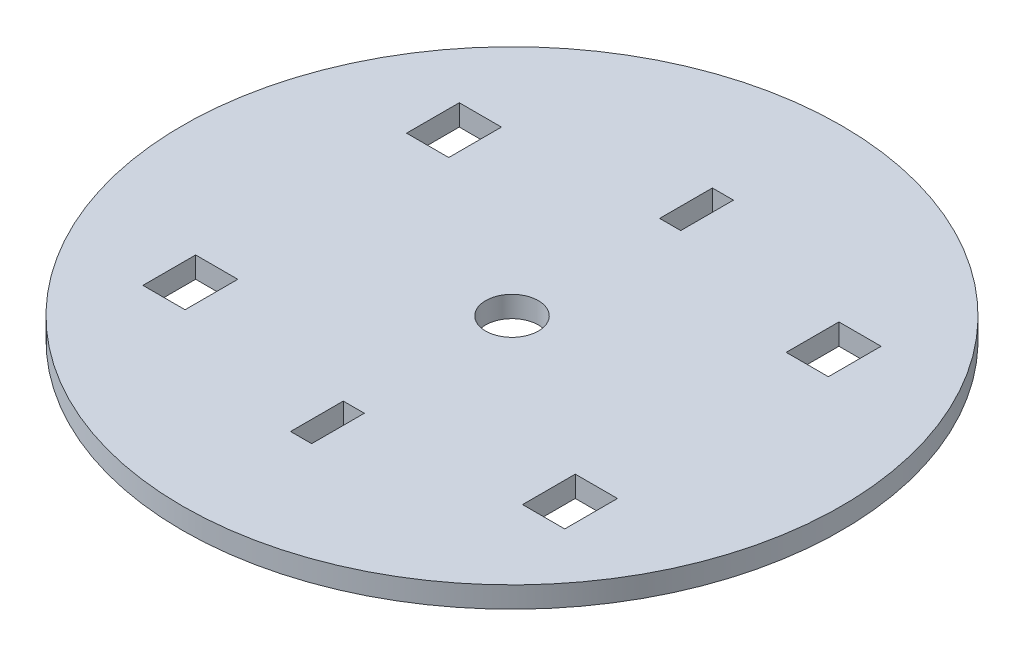
ISO-10303-21;
HEADER;
FILE_DESCRIPTION(('STEP AP214'),'2;1');
FILE_NAME('part.step','',(''),(''),'','','');
FILE_SCHEMA(('AUTOMOTIVE_DESIGN { 1 0 10303 214 1 1 1 1 }'));
ENDSEC;
DATA;
#1=APPLICATION_CONTEXT('core data for automotive mechanical design processes');
#2=APPLICATION_PROTOCOL_DEFINITION('international standard','automotive_design',2000,#1);
#3=PRODUCT_CONTEXT('',#1,'mechanical');
#4=PRODUCT('Part','Part','',(#3));
#5=PRODUCT_RELATED_PRODUCT_CATEGORY('part','',(#4));
#6=PRODUCT_DEFINITION_FORMATION('','',#4);
#7=PRODUCT_DEFINITION_CONTEXT('part definition',#1,'design');
#8=PRODUCT_DEFINITION('design','',#6,#7);
#9=PRODUCT_DEFINITION_SHAPE('','',#8);
#10=(LENGTH_UNIT() NAMED_UNIT(*) SI_UNIT(.MILLI.,.METRE.));
#11=(NAMED_UNIT(*) PLANE_ANGLE_UNIT() SI_UNIT($,.RADIAN.));
#12=(NAMED_UNIT(*) SI_UNIT($,.STERADIAN.) SOLID_ANGLE_UNIT());
#13=UNCERTAINTY_MEASURE_WITH_UNIT(LENGTH_MEASURE(1.E-05),#10,'distance_accuracy_value','');
#14=(GEOMETRIC_REPRESENTATION_CONTEXT(3) GLOBAL_UNCERTAINTY_ASSIGNED_CONTEXT((#13)) GLOBAL_UNIT_ASSIGNED_CONTEXT((#10,
#11,#12)) REPRESENTATION_CONTEXT('',''));
#15=CARTESIAN_POINT('',(0.,0.,0.));
#16=DIRECTION('',(0.,0.,1.));
#17=DIRECTION('',(1.,0.,0.));
#18=AXIS2_PLACEMENT_3D('',#15,#16,#17);
#19=CARTESIAN_POINT('',(0.,8.,0.));
#20=DIRECTION('',(0.,1.,0.));
#21=DIRECTION('',(0.,0.,1.));
#22=AXIS2_PLACEMENT_3D('',#19,#20,#21);
#23=PLANE('',#22);
#24=DIRECTION('',(0.,0.,-1.));
#25=VECTOR('',#24,1.);
#26=CARTESIAN_POINT('',(4.,8.,-60.));
#27=LINE('',#26,#25);
#28=CARTESIAN_POINT('',(4.,8.,-60.));
#29=VERTEX_POINT('',#28);
#30=CARTESIAN_POINT('',(4.,8.,-80.));
#31=VERTEX_POINT('',#30);
#32=EDGE_CURVE('E228',#29,#31,#27,.T.);
#33=ORIENTED_EDGE('',*,*,#32,.F.);
#34=DIRECTION('',(1.,0.,0.));
#35=VECTOR('',#34,1.);
#36=CARTESIAN_POINT('',(-4.,8.,-60.));
#37=LINE('',#36,#35);
#38=CARTESIAN_POINT('',(-4.,8.,-60.));
#39=VERTEX_POINT('',#38);
#40=EDGE_CURVE('E236',#39,#29,#37,.T.);
#41=ORIENTED_EDGE('',*,*,#40,.F.);
#42=DIRECTION('',(0.,0.,1.));
#43=VECTOR('',#42,1.);
#44=CARTESIAN_POINT('',(-4.,8.,-60.));
#45=LINE('',#44,#43);
#46=CARTESIAN_POINT('',(-4.,8.,-80.));
#47=VERTEX_POINT('',#46);
#48=EDGE_CURVE('E250',#47,#39,#45,.T.);
#49=ORIENTED_EDGE('',*,*,#48,.F.);
#50=DIRECTION('',(-1.,0.,0.));
#51=VECTOR('',#50,1.);
#52=CARTESIAN_POINT('',(-4.,8.,-80.));
#53=LINE('',#52,#51);
#54=EDGE_CURVE('E247',#31,#47,#53,.T.);
#55=ORIENTED_EDGE('',*,*,#54,.F.);
#56=EDGE_LOOP('',(#33,#41,#49,#55));
#57=FACE_BOUND('',#56,.T.);
#58=DIRECTION('',(0.,0.,1.));
#59=VECTOR('',#58,1.);
#60=CARTESIAN_POINT('',(-80.,8.,40.));
#61=LINE('',#60,#59);
#62=CARTESIAN_POINT('',(-80.,8.,40.));
#63=VERTEX_POINT('',#62);
#64=CARTESIAN_POINT('',(-80.,8.,60.));
#65=VERTEX_POINT('',#64);
#66=EDGE_CURVE('E264',#63,#65,#61,.T.);
#67=ORIENTED_EDGE('',*,*,#66,.F.);
#68=DIRECTION('',(-1.,0.,0.));
#69=VECTOR('',#68,1.);
#70=CARTESIAN_POINT('',(-80.,8.,40.));
#71=LINE('',#70,#69);
#72=CARTESIAN_POINT('',(-64.,8.,40.));
#73=VERTEX_POINT('',#72);
#74=EDGE_CURVE('E273',#73,#63,#71,.T.);
#75=ORIENTED_EDGE('',*,*,#74,.F.);
#76=DIRECTION('',(0.,0.,-1.));
#77=VECTOR('',#76,1.);
#78=CARTESIAN_POINT('',(-64.,8.,40.));
#79=LINE('',#78,#77);
#80=CARTESIAN_POINT('',(-64.,8.,60.));
#81=VERTEX_POINT('',#80);
#82=EDGE_CURVE('E270',#81,#73,#79,.T.);
#83=ORIENTED_EDGE('',*,*,#82,.F.);
#84=DIRECTION('',(1.,0.,0.));
#85=VECTOR('',#84,1.);
#86=CARTESIAN_POINT('',(-80.,8.,60.));
#87=LINE('',#86,#85);
#88=EDGE_CURVE('E266',#65,#81,#87,.T.);
#89=ORIENTED_EDGE('',*,*,#88,.F.);
#90=EDGE_LOOP('',(#67,#75,#83,#89));
#91=FACE_BOUND('',#90,.T.);
#92=DIRECTION('',(0.,0.,1.));
#93=VECTOR('',#92,1.);
#94=CARTESIAN_POINT('',(64.,8.,-60.));
#95=LINE('',#94,#93);
#96=CARTESIAN_POINT('',(64.,8.,-60.));
#97=VERTEX_POINT('',#96);
#98=CARTESIAN_POINT('',(64.,8.,-40.));
#99=VERTEX_POINT('',#98);
#100=EDGE_CURVE('E286',#97,#99,#95,.T.);
#101=ORIENTED_EDGE('',*,*,#100,.F.);
#102=DIRECTION('',(-1.,0.,0.));
#103=VECTOR('',#102,1.);
#104=CARTESIAN_POINT('',(64.,8.,-60.));
#105=LINE('',#104,#103);
#106=CARTESIAN_POINT('',(80.,8.,-60.));
#107=VERTEX_POINT('',#106);
#108=EDGE_CURVE('E295',#107,#97,#105,.T.);
#109=ORIENTED_EDGE('',*,*,#108,.F.);
#110=DIRECTION('',(0.,0.,-1.));
#111=VECTOR('',#110,1.);
#112=CARTESIAN_POINT('',(80.,8.,-60.));
#113=LINE('',#112,#111);
#114=CARTESIAN_POINT('',(80.,8.,-40.));
#115=VERTEX_POINT('',#114);
#116=EDGE_CURVE('E292',#115,#107,#113,.T.);
#117=ORIENTED_EDGE('',*,*,#116,.F.);
#118=DIRECTION('',(1.,0.,0.));
#119=VECTOR('',#118,1.);
#120=CARTESIAN_POINT('',(64.,8.,-40.));
#121=LINE('',#120,#119);
#122=EDGE_CURVE('E288',#99,#115,#121,.T.);
#123=ORIENTED_EDGE('',*,*,#122,.F.);
#124=EDGE_LOOP('',(#101,#109,#117,#123));
#125=FACE_BOUND('',#124,.T.);
#126=DIRECTION('',(0.,0.,1.));
#127=VECTOR('',#126,1.);
#128=CARTESIAN_POINT('',(64.,8.,40.));
#129=LINE('',#128,#127);
#130=CARTESIAN_POINT('',(64.,8.,40.));
#131=VERTEX_POINT('',#130);
#132=CARTESIAN_POINT('',(64.,8.,60.));
#133=VERTEX_POINT('',#132);
#134=EDGE_CURVE('E257',#131,#133,#129,.T.);
#135=ORIENTED_EDGE('',*,*,#134,.F.);
#136=DIRECTION('',(-1.,0.,0.));
#137=VECTOR('',#136,1.);
#138=CARTESIAN_POINT('',(64.,8.,40.));
#139=LINE('',#138,#137);
#140=CARTESIAN_POINT('',(80.,8.,40.));
#141=VERTEX_POINT('',#140);
#142=EDGE_CURVE('E313',#141,#131,#139,.T.);
#143=ORIENTED_EDGE('',*,*,#142,.F.);
#144=DIRECTION('',(0.,0.,-1.));
#145=VECTOR('',#144,1.);
#146=CARTESIAN_POINT('',(80.,8.,40.));
#147=LINE('',#146,#145);
#148=CARTESIAN_POINT('',(80.,8.,60.));
#149=VERTEX_POINT('',#148);
#150=EDGE_CURVE('E310',#149,#141,#147,.T.);
#151=ORIENTED_EDGE('',*,*,#150,.F.);
#152=DIRECTION('',(1.,0.,0.));
#153=VECTOR('',#152,1.);
#154=CARTESIAN_POINT('',(64.,8.,60.));
#155=LINE('',#154,#153);
#156=EDGE_CURVE('E307',#133,#149,#155,.T.);
#157=ORIENTED_EDGE('',*,*,#156,.F.);
#158=EDGE_LOOP('',(#135,#143,#151,#157));
#159=FACE_BOUND('',#158,.T.);
#160=DIRECTION('',(0.,0.,1.));
#161=VECTOR('',#160,1.);
#162=CARTESIAN_POINT('',(-80.,8.,-60.));
#163=LINE('',#162,#161);
#164=CARTESIAN_POINT('',(-80.,8.,-60.));
#165=VERTEX_POINT('',#164);
#166=CARTESIAN_POINT('',(-80.,8.,-40.));
#167=VERTEX_POINT('',#166);
#168=EDGE_CURVE('E279',#165,#167,#163,.T.);
#169=ORIENTED_EDGE('',*,*,#168,.F.);
#170=DIRECTION('',(-1.,0.,0.));
#171=VECTOR('',#170,1.);
#172=CARTESIAN_POINT('',(-80.,8.,-60.));
#173=LINE('',#172,#171);
#174=CARTESIAN_POINT('',(-64.,8.,-60.));
#175=VERTEX_POINT('',#174);
#176=EDGE_CURVE('E331',#175,#165,#173,.T.);
#177=ORIENTED_EDGE('',*,*,#176,.F.);
#178=DIRECTION('',(0.,0.,-1.));
#179=VECTOR('',#178,1.);
#180=CARTESIAN_POINT('',(-64.,8.,-60.));
#181=LINE('',#180,#179);
#182=CARTESIAN_POINT('',(-64.,8.,-40.));
#183=VERTEX_POINT('',#182);
#184=EDGE_CURVE('E328',#183,#175,#181,.T.);
#185=ORIENTED_EDGE('',*,*,#184,.F.);
#186=DIRECTION('',(1.,0.,0.));
#187=VECTOR('',#186,1.);
#188=CARTESIAN_POINT('',(-80.,8.,-40.));
#189=LINE('',#188,#187);
#190=EDGE_CURVE('E325',#167,#183,#189,.T.);
#191=ORIENTED_EDGE('',*,*,#190,.F.);
#192=EDGE_LOOP('',(#169,#177,#185,#191));
#193=FACE_BOUND('',#192,.T.);
#194=CARTESIAN_POINT('',(0.,8.,0.));
#195=DIRECTION('',(0.,1.,0.));
#196=DIRECTION('',(0.,0.,1.));
#197=AXIS2_PLACEMENT_3D('',#194,#195,#196);
#198=CIRCLE('',#197,125.);
#199=CARTESIAN_POINT('',(0.,8.,125.));
#200=VERTEX_POINT('',#199);
#201=EDGE_CURVE('E350',#200,#200,#198,.T.);
#202=ORIENTED_EDGE('',*,*,#201,.T.);
#203=EDGE_LOOP('',(#202));
#204=FACE_BOUND('',#203,.T.);
#205=CARTESIAN_POINT('',(0.,8.,0.));
#206=DIRECTION('',(0.,1.,0.));
#207=DIRECTION('',(0.,0.,1.));
#208=AXIS2_PLACEMENT_3D('',#205,#206,#207);
#209=CIRCLE('',#208,10.);
#210=CARTESIAN_POINT('',(0.,8.,10.));
#211=VERTEX_POINT('',#210);
#212=EDGE_CURVE('E344',#211,#211,#209,.T.);
#213=ORIENTED_EDGE('',*,*,#212,.F.);
#214=EDGE_LOOP('',(#213));
#215=FACE_BOUND('',#214,.T.);
#216=DIRECTION('',(1.,0.,0.));
#217=VECTOR('',#216,1.);
#218=CARTESIAN_POINT('',(-4.,8.,60.));
#219=LINE('',#218,#217);
#220=CARTESIAN_POINT('',(-4.,8.,60.));
#221=VERTEX_POINT('',#220);
#222=CARTESIAN_POINT('',(4.,8.,60.));
#223=VERTEX_POINT('',#222);
#224=EDGE_CURVE('E222',#221,#223,#219,.T.);
#225=ORIENTED_EDGE('',*,*,#224,.T.);
#226=DIRECTION('',(0.,0.,1.));
#227=VECTOR('',#226,1.);
#228=CARTESIAN_POINT('',(4.,8.,60.));
#229=LINE('',#228,#227);
#230=CARTESIAN_POINT('',(4.,8.,80.));
#231=VERTEX_POINT('',#230);
#232=EDGE_CURVE('E51',#223,#231,#229,.T.);
#233=ORIENTED_EDGE('',*,*,#232,.T.);
#234=DIRECTION('',(-1.,0.,0.));
#235=VECTOR('',#234,1.);
#236=CARTESIAN_POINT('',(-4.,8.,80.));
#237=LINE('',#236,#235);
#238=CARTESIAN_POINT('',(-4.,8.,80.));
#239=VERTEX_POINT('',#238);
#240=EDGE_CURVE('E213',#231,#239,#237,.T.);
#241=ORIENTED_EDGE('',*,*,#240,.T.);
#242=DIRECTION('',(0.,0.,-1.));
#243=VECTOR('',#242,1.);
#244=CARTESIAN_POINT('',(-4.,8.,60.));
#245=LINE('',#244,#243);
#246=EDGE_CURVE('E216',#239,#221,#245,.T.);
#247=ORIENTED_EDGE('',*,*,#246,.T.);
#248=EDGE_LOOP('',(#225,#233,#241,#247));
#249=FACE_BOUND('',#248,.T.);
#250=ADVANCED_FACE('F36',(#57,#91,#125,#159,#193,#204,#215,#249),#23,.T.);
#251=CARTESIAN_POINT('',(0.,0.,0.));
#252=DIRECTION('',(0.,1.,0.));
#253=DIRECTION('',(0.,0.,1.));
#254=AXIS2_PLACEMENT_3D('',#251,#252,#253);
#255=PLANE('',#254);
#256=CARTESIAN_POINT('',(0.,0.,0.));
#257=DIRECTION('',(0.,1.,0.));
#258=DIRECTION('',(0.,0.,1.));
#259=AXIS2_PLACEMENT_3D('',#256,#257,#258);
#260=CIRCLE('',#259,10.);
#261=CARTESIAN_POINT('',(0.,0.,10.));
#262=VERTEX_POINT('',#261);
#263=EDGE_CURVE('E337',#262,#262,#260,.T.);
#264=ORIENTED_EDGE('',*,*,#263,.T.);
#265=EDGE_LOOP('',(#264));
#266=FACE_BOUND('',#265,.T.);
#267=CARTESIAN_POINT('',(0.,0.,0.));
#268=DIRECTION('',(0.,1.,0.));
#269=DIRECTION('',(0.,0.,1.));
#270=AXIS2_PLACEMENT_3D('',#267,#268,#269);
#271=CIRCLE('',#270,125.);
#272=CARTESIAN_POINT('',(0.,0.,125.));
#273=VERTEX_POINT('',#272);
#274=EDGE_CURVE('E347',#273,#273,#271,.T.);
#275=ORIENTED_EDGE('',*,*,#274,.F.);
#276=EDGE_LOOP('',(#275));
#277=FACE_BOUND('',#276,.T.);
#278=DIRECTION('',(-1.,0.,0.));
#279=VECTOR('',#278,1.);
#280=CARTESIAN_POINT('',(0.,0.,-60.));
#281=LINE('',#280,#279);
#282=CARTESIAN_POINT('',(-64.,0.,-60.));
#283=VERTEX_POINT('',#282);
#284=CARTESIAN_POINT('',(-80.,0.,-60.));
#285=VERTEX_POINT('',#284);
#286=EDGE_CURVE('E361',#283,#285,#281,.T.);
#287=ORIENTED_EDGE('',*,*,#286,.T.);
#288=DIRECTION('',(0.,0.,1.));
#289=VECTOR('',#288,1.);
#290=CARTESIAN_POINT('',(-80.,0.,0.));
#291=LINE('',#290,#289);
#292=CARTESIAN_POINT('',(-80.,0.,-40.));
#293=VERTEX_POINT('',#292);
#294=EDGE_CURVE('E364',#285,#293,#291,.T.);
#295=ORIENTED_EDGE('',*,*,#294,.T.);
#296=DIRECTION('',(1.,0.,0.));
#297=VECTOR('',#296,1.);
#298=CARTESIAN_POINT('',(0.,0.,-40.));
#299=LINE('',#298,#297);
#300=CARTESIAN_POINT('',(-64.,0.,-40.));
#301=VERTEX_POINT('',#300);
#302=EDGE_CURVE('E353',#293,#301,#299,.T.);
#303=ORIENTED_EDGE('',*,*,#302,.T.);
#304=DIRECTION('',(0.,0.,-1.));
#305=VECTOR('',#304,1.);
#306=CARTESIAN_POINT('',(-64.,0.,0.));
#307=LINE('',#306,#305);
#308=EDGE_CURVE('E358',#301,#283,#307,.T.);
#309=ORIENTED_EDGE('',*,*,#308,.T.);
#310=EDGE_LOOP('',(#287,#295,#303,#309));
#311=FACE_BOUND('',#310,.T.);
#312=DIRECTION('',(-1.,0.,0.));
#313=VECTOR('',#312,1.);
#314=CARTESIAN_POINT('',(0.,0.,40.));
#315=LINE('',#314,#313);
#316=CARTESIAN_POINT('',(80.,0.,40.));
#317=VERTEX_POINT('',#316);
#318=CARTESIAN_POINT('',(64.,0.,40.));
#319=VERTEX_POINT('',#318);
#320=EDGE_CURVE('E373',#317,#319,#315,.T.);
#321=ORIENTED_EDGE('',*,*,#320,.T.);
#322=DIRECTION('',(0.,0.,1.));
#323=VECTOR('',#322,1.);
#324=CARTESIAN_POINT('',(64.,0.,0.));
#325=LINE('',#324,#323);
#326=CARTESIAN_POINT('',(64.,0.,60.));
#327=VERTEX_POINT('',#326);
#328=EDGE_CURVE('E376',#319,#327,#325,.T.);
#329=ORIENTED_EDGE('',*,*,#328,.T.);
#330=DIRECTION('',(1.,0.,0.));
#331=VECTOR('',#330,1.);
#332=CARTESIAN_POINT('',(0.,0.,60.));
#333=LINE('',#332,#331);
#334=CARTESIAN_POINT('',(80.,0.,60.));
#335=VERTEX_POINT('',#334);
#336=EDGE_CURVE('E367',#327,#335,#333,.T.);
#337=ORIENTED_EDGE('',*,*,#336,.T.);
#338=DIRECTION('',(0.,0.,-1.));
#339=VECTOR('',#338,1.);
#340=CARTESIAN_POINT('',(80.,0.,0.));
#341=LINE('',#340,#339);
#342=EDGE_CURVE('E370',#335,#317,#341,.T.);
#343=ORIENTED_EDGE('',*,*,#342,.T.);
#344=EDGE_LOOP('',(#321,#329,#337,#343));
#345=FACE_BOUND('',#344,.T.);
#346=DIRECTION('',(-1.,0.,0.));
#347=VECTOR('',#346,1.);
#348=CARTESIAN_POINT('',(0.,0.,-60.));
#349=LINE('',#348,#347);
#350=CARTESIAN_POINT('',(80.,0.,-60.));
#351=VERTEX_POINT('',#350);
#352=CARTESIAN_POINT('',(64.,0.,-60.));
#353=VERTEX_POINT('',#352);
#354=EDGE_CURVE('E385',#351,#353,#349,.T.);
#355=ORIENTED_EDGE('',*,*,#354,.T.);
#356=DIRECTION('',(0.,0.,1.));
#357=VECTOR('',#356,1.);
#358=CARTESIAN_POINT('',(64.,0.,0.));
#359=LINE('',#358,#357);
#360=CARTESIAN_POINT('',(64.,0.,-40.));
#361=VERTEX_POINT('',#360);
#362=EDGE_CURVE('E388',#353,#361,#359,.T.);
#363=ORIENTED_EDGE('',*,*,#362,.T.);
#364=DIRECTION('',(1.,0.,0.));
#365=VECTOR('',#364,1.);
#366=CARTESIAN_POINT('',(0.,0.,-40.));
#367=LINE('',#366,#365);
#368=CARTESIAN_POINT('',(80.,0.,-40.));
#369=VERTEX_POINT('',#368);
#370=EDGE_CURVE('E379',#361,#369,#367,.T.);
#371=ORIENTED_EDGE('',*,*,#370,.T.);
#372=DIRECTION('',(0.,0.,-1.));
#373=VECTOR('',#372,1.);
#374=CARTESIAN_POINT('',(80.,0.,0.));
#375=LINE('',#374,#373);
#376=EDGE_CURVE('E382',#369,#351,#375,.T.);
#377=ORIENTED_EDGE('',*,*,#376,.T.);
#378=EDGE_LOOP('',(#355,#363,#371,#377));
#379=FACE_BOUND('',#378,.T.);
#380=DIRECTION('',(-1.,0.,0.));
#381=VECTOR('',#380,1.);
#382=CARTESIAN_POINT('',(0.,0.,40.));
#383=LINE('',#382,#381);
#384=CARTESIAN_POINT('',(-64.,0.,40.));
#385=VERTEX_POINT('',#384);
#386=CARTESIAN_POINT('',(-80.,0.,40.));
#387=VERTEX_POINT('',#386);
#388=EDGE_CURVE('E44',#385,#387,#383,.T.);
#389=ORIENTED_EDGE('',*,*,#388,.T.);
#390=DIRECTION('',(0.,0.,1.));
#391=VECTOR('',#390,1.);
#392=CARTESIAN_POINT('',(-80.,0.,0.));
#393=LINE('',#392,#391);
#394=CARTESIAN_POINT('',(-80.,0.,60.));
#395=VERTEX_POINT('',#394);
#396=EDGE_CURVE('E11',#387,#395,#393,.T.);
#397=ORIENTED_EDGE('',*,*,#396,.T.);
#398=DIRECTION('',(1.,0.,0.));
#399=VECTOR('',#398,1.);
#400=CARTESIAN_POINT('',(0.,0.,60.));
#401=LINE('',#400,#399);
#402=CARTESIAN_POINT('',(-64.,0.,60.));
#403=VERTEX_POINT('',#402);
#404=EDGE_CURVE('E391',#395,#403,#401,.T.);
#405=ORIENTED_EDGE('',*,*,#404,.T.);
#406=DIRECTION('',(0.,0.,-1.));
#407=VECTOR('',#406,1.);
#408=CARTESIAN_POINT('',(-64.,0.,0.));
#409=LINE('',#408,#407);
#410=EDGE_CURVE('E394',#403,#385,#409,.T.);
#411=ORIENTED_EDGE('',*,*,#410,.T.);
#412=EDGE_LOOP('',(#389,#397,#405,#411));
#413=FACE_BOUND('',#412,.T.);
#414=DIRECTION('',(1.,0.,0.));
#415=VECTOR('',#414,1.);
#416=CARTESIAN_POINT('',(-4.,0.,-60.));
#417=LINE('',#416,#415);
#418=CARTESIAN_POINT('',(-4.,0.,-60.));
#419=VERTEX_POINT('',#418);
#420=CARTESIAN_POINT('',(4.,0.,-60.));
#421=VERTEX_POINT('',#420);
#422=EDGE_CURVE('E242',#419,#421,#417,.T.);
#423=ORIENTED_EDGE('',*,*,#422,.T.);
#424=DIRECTION('',(0.,0.,-1.));
#425=VECTOR('',#424,1.);
#426=CARTESIAN_POINT('',(4.,0.,-60.));
#427=LINE('',#426,#425);
#428=CARTESIAN_POINT('',(4.,0.,-80.));
#429=VERTEX_POINT('',#428);
#430=EDGE_CURVE('E232',#421,#429,#427,.T.);
#431=ORIENTED_EDGE('',*,*,#430,.T.);
#432=DIRECTION('',(-1.,0.,0.));
#433=VECTOR('',#432,1.);
#434=CARTESIAN_POINT('',(-4.,0.,-80.));
#435=LINE('',#434,#433);
#436=CARTESIAN_POINT('',(-4.,0.,-80.));
#437=VERTEX_POINT('',#436);
#438=EDGE_CURVE('E235',#429,#437,#435,.T.);
#439=ORIENTED_EDGE('',*,*,#438,.T.);
#440=DIRECTION('',(0.,0.,1.));
#441=VECTOR('',#440,1.);
#442=CARTESIAN_POINT('',(-4.,0.,-60.));
#443=LINE('',#442,#441);
#444=EDGE_CURVE('E239',#437,#419,#443,.T.);
#445=ORIENTED_EDGE('',*,*,#444,.T.);
#446=EDGE_LOOP('',(#423,#431,#439,#445));
#447=FACE_BOUND('',#446,.T.);
#448=DIRECTION('',(0.,0.,1.));
#449=VECTOR('',#448,1.);
#450=CARTESIAN_POINT('',(4.,0.,60.));
#451=LINE('',#450,#449);
#452=CARTESIAN_POINT('',(4.,0.,60.));
#453=VERTEX_POINT('',#452);
#454=CARTESIAN_POINT('',(4.,0.,80.));
#455=VERTEX_POINT('',#454);
#456=EDGE_CURVE('E205',#453,#455,#451,.T.);
#457=ORIENTED_EDGE('',*,*,#456,.F.);
#458=DIRECTION('',(1.,0.,0.));
#459=VECTOR('',#458,1.);
#460=CARTESIAN_POINT('',(-4.,0.,60.));
#461=LINE('',#460,#459);
#462=CARTESIAN_POINT('',(-4.,0.,60.));
#463=VERTEX_POINT('',#462);
#464=EDGE_CURVE('E197',#463,#453,#461,.T.);
#465=ORIENTED_EDGE('',*,*,#464,.F.);
#466=DIRECTION('',(0.,0.,-1.));
#467=VECTOR('',#466,1.);
#468=CARTESIAN_POINT('',(-4.,0.,60.));
#469=LINE('',#468,#467);
#470=CARTESIAN_POINT('',(-4.,0.,80.));
#471=VERTEX_POINT('',#470);
#472=EDGE_CURVE('E204',#471,#463,#469,.T.);
#473=ORIENTED_EDGE('',*,*,#472,.F.);
#474=DIRECTION('',(-1.,0.,0.));
#475=VECTOR('',#474,1.);
#476=CARTESIAN_POINT('',(-4.,0.,80.));
#477=LINE('',#476,#475);
#478=EDGE_CURVE('E209',#455,#471,#477,.T.);
#479=ORIENTED_EDGE('',*,*,#478,.F.);
#480=EDGE_LOOP('',(#457,#465,#473,#479));
#481=FACE_BOUND('',#480,.T.);
#482=ADVANCED_FACE('F212',(#266,#277,#311,#345,#379,#413,#447,#481),#255,.F.);
#483=CARTESIAN_POINT('',(0.,8.,0.));
#484=DIRECTION('',(0.,-1.,0.));
#485=DIRECTION('',(0.,0.,-1.));
#486=AXIS2_PLACEMENT_3D('',#483,#484,#485);
#487=CYLINDRICAL_SURFACE('',#486,125.);
#488=ORIENTED_EDGE('',*,*,#201,.F.);
#489=EDGE_LOOP('',(#488));
#490=FACE_BOUND('',#489,.T.);
#491=ORIENTED_EDGE('',*,*,#274,.T.);
#492=EDGE_LOOP('',(#491));
#493=FACE_BOUND('',#492,.T.);
#494=ADVANCED_FACE('F38',(#490,#493),#487,.T.);
#495=CARTESIAN_POINT('',(0.,8.,0.));
#496=DIRECTION('',(0.,-1.,0.));
#497=DIRECTION('',(0.,0.,-1.));
#498=AXIS2_PLACEMENT_3D('',#495,#496,#497);
#499=CYLINDRICAL_SURFACE('',#498,10.);
#500=ORIENTED_EDGE('',*,*,#212,.T.);
#501=EDGE_LOOP('',(#500));
#502=FACE_BOUND('',#501,.T.);
#503=ORIENTED_EDGE('',*,*,#263,.F.);
#504=EDGE_LOOP('',(#503));
#505=FACE_BOUND('',#504,.T.);
#506=ADVANCED_FACE('F440',(#502,#505),#499,.F.);
#507=CARTESIAN_POINT('',(-80.,-2.,-60.));
#508=DIRECTION('',(-1.,0.,0.));
#509=DIRECTION('',(0.,0.,1.));
#510=AXIS2_PLACEMENT_3D('',#507,#508,#509);
#511=PLANE('',#510);
#512=DIRECTION('',(0.,1.,0.));
#513=VECTOR('',#512,1.);
#514=CARTESIAN_POINT('',(-80.,-2.,-60.));
#515=LINE('',#514,#513);
#516=EDGE_CURVE('E335',#285,#165,#515,.T.);
#517=ORIENTED_EDGE('',*,*,#516,.T.);
#518=ORIENTED_EDGE('',*,*,#168,.T.);
#519=DIRECTION('',(0.,1.,0.));
#520=VECTOR('',#519,1.);
#521=CARTESIAN_POINT('',(-80.,-2.,-40.));
#522=LINE('',#521,#520);
#523=EDGE_CURVE('E334',#293,#167,#522,.T.);
#524=ORIENTED_EDGE('',*,*,#523,.F.);
#525=ORIENTED_EDGE('',*,*,#294,.F.);
#526=EDGE_LOOP('',(#517,#518,#524,#525));
#527=FACE_BOUND('',#526,.T.);
#528=ADVANCED_FACE('F443',(#527),#511,.F.);
#529=CARTESIAN_POINT('',(-80.,-2.,-60.));
#530=DIRECTION('',(0.,0.,-1.));
#531=DIRECTION('',(-1.,0.,0.));
#532=AXIS2_PLACEMENT_3D('',#529,#530,#531);
#533=PLANE('',#532);
#534=DIRECTION('',(0.,1.,0.));
#535=VECTOR('',#534,1.);
#536=CARTESIAN_POINT('',(-64.,-2.,-60.));
#537=LINE('',#536,#535);
#538=EDGE_CURVE('E338',#283,#175,#537,.T.);
#539=ORIENTED_EDGE('',*,*,#538,.T.);
#540=ORIENTED_EDGE('',*,*,#176,.T.);
#541=ORIENTED_EDGE('',*,*,#516,.F.);
#542=ORIENTED_EDGE('',*,*,#286,.F.);
#543=EDGE_LOOP('',(#539,#540,#541,#542));
#544=FACE_BOUND('',#543,.T.);
#545=ADVANCED_FACE('F447',(#544),#533,.F.);
#546=CARTESIAN_POINT('',(-64.,-2.,-60.));
#547=DIRECTION('',(1.,0.,0.));
#548=DIRECTION('',(0.,0.,-1.));
#549=AXIS2_PLACEMENT_3D('',#546,#547,#548);
#550=PLANE('',#549);
#551=DIRECTION('',(0.,1.,0.));
#552=VECTOR('',#551,1.);
#553=CARTESIAN_POINT('',(-64.,-2.,-40.));
#554=LINE('',#553,#552);
#555=EDGE_CURVE('E340',#301,#183,#554,.T.);
#556=ORIENTED_EDGE('',*,*,#555,.T.);
#557=ORIENTED_EDGE('',*,*,#184,.T.);
#558=ORIENTED_EDGE('',*,*,#538,.F.);
#559=ORIENTED_EDGE('',*,*,#308,.F.);
#560=EDGE_LOOP('',(#556,#557,#558,#559));
#561=FACE_BOUND('',#560,.T.);
#562=ADVANCED_FACE('F453',(#561),#550,.F.);
#563=CARTESIAN_POINT('',(-80.,-2.,-40.));
#564=DIRECTION('',(0.,0.,1.));
#565=DIRECTION('',(1.,0.,0.));
#566=AXIS2_PLACEMENT_3D('',#563,#564,#565);
#567=PLANE('',#566);
#568=ORIENTED_EDGE('',*,*,#523,.T.);
#569=ORIENTED_EDGE('',*,*,#190,.T.);
#570=ORIENTED_EDGE('',*,*,#555,.F.);
#571=ORIENTED_EDGE('',*,*,#302,.F.);
#572=EDGE_LOOP('',(#568,#569,#570,#571));
#573=FACE_BOUND('',#572,.T.);
#574=ADVANCED_FACE('F449',(#573),#567,.F.);
#575=CARTESIAN_POINT('',(64.,-2.,40.));
#576=DIRECTION('',(-1.,0.,0.));
#577=DIRECTION('',(0.,0.,1.));
#578=AXIS2_PLACEMENT_3D('',#575,#576,#577);
#579=PLANE('',#578);
#580=DIRECTION('',(0.,1.,0.));
#581=VECTOR('',#580,1.);
#582=CARTESIAN_POINT('',(64.,-2.,40.));
#583=LINE('',#582,#581);
#584=EDGE_CURVE('E289',#319,#131,#583,.T.);
#585=ORIENTED_EDGE('',*,*,#584,.T.);
#586=ORIENTED_EDGE('',*,*,#134,.T.);
#587=DIRECTION('',(0.,1.,0.));
#588=VECTOR('',#587,1.);
#589=CARTESIAN_POINT('',(64.,-2.,60.));
#590=LINE('',#589,#588);
#591=EDGE_CURVE('E316',#327,#133,#590,.T.);
#592=ORIENTED_EDGE('',*,*,#591,.F.);
#593=ORIENTED_EDGE('',*,*,#328,.F.);
#594=EDGE_LOOP('',(#585,#586,#592,#593));
#595=FACE_BOUND('',#594,.T.);
#596=ADVANCED_FACE('F452',(#595),#579,.F.);
#597=CARTESIAN_POINT('',(64.,-2.,40.));
#598=DIRECTION('',(0.,0.,-1.));
#599=DIRECTION('',(-1.,0.,0.));
#600=AXIS2_PLACEMENT_3D('',#597,#598,#599);
#601=PLANE('',#600);
#602=DIRECTION('',(0.,1.,0.));
#603=VECTOR('',#602,1.);
#604=CARTESIAN_POINT('',(80.,-2.,40.));
#605=LINE('',#604,#603);
#606=EDGE_CURVE('E318',#317,#141,#605,.T.);
#607=ORIENTED_EDGE('',*,*,#606,.T.);
#608=ORIENTED_EDGE('',*,*,#142,.T.);
#609=ORIENTED_EDGE('',*,*,#584,.F.);
#610=ORIENTED_EDGE('',*,*,#320,.F.);
#611=EDGE_LOOP('',(#607,#608,#609,#610));
#612=FACE_BOUND('',#611,.T.);
#613=ADVANCED_FACE('F463',(#612),#601,.F.);
#614=CARTESIAN_POINT('',(80.,-2.,40.));
#615=DIRECTION('',(1.,0.,0.));
#616=DIRECTION('',(0.,0.,-1.));
#617=AXIS2_PLACEMENT_3D('',#614,#615,#616);
#618=PLANE('',#617);
#619=DIRECTION('',(0.,1.,0.));
#620=VECTOR('',#619,1.);
#621=CARTESIAN_POINT('',(80.,-2.,60.));
#622=LINE('',#621,#620);
#623=EDGE_CURVE('E320',#335,#149,#622,.T.);
#624=ORIENTED_EDGE('',*,*,#623,.T.);
#625=ORIENTED_EDGE('',*,*,#150,.T.);
#626=ORIENTED_EDGE('',*,*,#606,.F.);
#627=ORIENTED_EDGE('',*,*,#342,.F.);
#628=EDGE_LOOP('',(#624,#625,#626,#627));
#629=FACE_BOUND('',#628,.T.);
#630=ADVANCED_FACE('F469',(#629),#618,.F.);
#631=CARTESIAN_POINT('',(64.,-2.,60.));
#632=DIRECTION('',(0.,0.,1.));
#633=DIRECTION('',(1.,0.,0.));
#634=AXIS2_PLACEMENT_3D('',#631,#632,#633);
#635=PLANE('',#634);
#636=ORIENTED_EDGE('',*,*,#591,.T.);
#637=ORIENTED_EDGE('',*,*,#156,.T.);
#638=ORIENTED_EDGE('',*,*,#623,.F.);
#639=ORIENTED_EDGE('',*,*,#336,.F.);
#640=EDGE_LOOP('',(#636,#637,#638,#639));
#641=FACE_BOUND('',#640,.T.);
#642=ADVANCED_FACE('F465',(#641),#635,.F.);
#643=CARTESIAN_POINT('',(64.,-2.,-60.));
#644=DIRECTION('',(-1.,0.,0.));
#645=DIRECTION('',(0.,0.,1.));
#646=AXIS2_PLACEMENT_3D('',#643,#644,#645);
#647=PLANE('',#646);
#648=DIRECTION('',(0.,1.,0.));
#649=VECTOR('',#648,1.);
#650=CARTESIAN_POINT('',(64.,-2.,-60.));
#651=LINE('',#650,#649);
#652=EDGE_CURVE('E267',#353,#97,#651,.T.);
#653=ORIENTED_EDGE('',*,*,#652,.T.);
#654=ORIENTED_EDGE('',*,*,#100,.T.);
#655=DIRECTION('',(0.,1.,0.));
#656=VECTOR('',#655,1.);
#657=CARTESIAN_POINT('',(64.,-2.,-40.));
#658=LINE('',#657,#656);
#659=EDGE_CURVE('E298',#361,#99,#658,.T.);
#660=ORIENTED_EDGE('',*,*,#659,.F.);
#661=ORIENTED_EDGE('',*,*,#362,.F.);
#662=EDGE_LOOP('',(#653,#654,#660,#661));
#663=FACE_BOUND('',#662,.T.);
#664=ADVANCED_FACE('F468',(#663),#647,.F.);
#665=CARTESIAN_POINT('',(64.,-2.,-60.));
#666=DIRECTION('',(0.,0.,-1.));
#667=DIRECTION('',(-1.,0.,0.));
#668=AXIS2_PLACEMENT_3D('',#665,#666,#667);
#669=PLANE('',#668);
#670=DIRECTION('',(0.,1.,0.));
#671=VECTOR('',#670,1.);
#672=CARTESIAN_POINT('',(80.,-2.,-60.));
#673=LINE('',#672,#671);
#674=EDGE_CURVE('E300',#351,#107,#673,.T.);
#675=ORIENTED_EDGE('',*,*,#674,.T.);
#676=ORIENTED_EDGE('',*,*,#108,.T.);
#677=ORIENTED_EDGE('',*,*,#652,.F.);
#678=ORIENTED_EDGE('',*,*,#354,.F.);
#679=EDGE_LOOP('',(#675,#676,#677,#678));
#680=FACE_BOUND('',#679,.T.);
#681=ADVANCED_FACE('F479',(#680),#669,.F.);
#682=CARTESIAN_POINT('',(80.,-2.,-60.));
#683=DIRECTION('',(1.,0.,0.));
#684=DIRECTION('',(0.,0.,-1.));
#685=AXIS2_PLACEMENT_3D('',#682,#683,#684);
#686=PLANE('',#685);
#687=DIRECTION('',(0.,1.,0.));
#688=VECTOR('',#687,1.);
#689=CARTESIAN_POINT('',(80.,-2.,-40.));
#690=LINE('',#689,#688);
#691=EDGE_CURVE('E302',#369,#115,#690,.T.);
#692=ORIENTED_EDGE('',*,*,#691,.T.);
#693=ORIENTED_EDGE('',*,*,#116,.T.);
#694=ORIENTED_EDGE('',*,*,#674,.F.);
#695=ORIENTED_EDGE('',*,*,#376,.F.);
#696=EDGE_LOOP('',(#692,#693,#694,#695));
#697=FACE_BOUND('',#696,.T.);
#698=ADVANCED_FACE('F484',(#697),#686,.F.);
#699=CARTESIAN_POINT('',(64.,-2.,-40.));
#700=DIRECTION('',(0.,0.,1.));
#701=DIRECTION('',(1.,0.,0.));
#702=AXIS2_PLACEMENT_3D('',#699,#700,#701);
#703=PLANE('',#702);
#704=ORIENTED_EDGE('',*,*,#659,.T.);
#705=ORIENTED_EDGE('',*,*,#122,.T.);
#706=ORIENTED_EDGE('',*,*,#691,.F.);
#707=ORIENTED_EDGE('',*,*,#370,.F.);
#708=EDGE_LOOP('',(#704,#705,#706,#707));
#709=FACE_BOUND('',#708,.T.);
#710=ADVANCED_FACE('F481',(#709),#703,.F.);
#711=CARTESIAN_POINT('',(-80.,-2.,40.));
#712=DIRECTION('',(-1.,0.,0.));
#713=DIRECTION('',(0.,0.,1.));
#714=AXIS2_PLACEMENT_3D('',#711,#712,#713);
#715=PLANE('',#714);
#716=DIRECTION('',(0.,1.,0.));
#717=VECTOR('',#716,1.);
#718=CARTESIAN_POINT('',(-80.,-2.,40.));
#719=LINE('',#718,#717);
#720=EDGE_CURVE('E277',#387,#63,#719,.T.);
#721=ORIENTED_EDGE('',*,*,#720,.T.);
#722=ORIENTED_EDGE('',*,*,#66,.T.);
#723=DIRECTION('',(0.,1.,0.));
#724=VECTOR('',#723,1.);
#725=CARTESIAN_POINT('',(-80.,-2.,60.));
#726=LINE('',#725,#724);
#727=EDGE_CURVE('E276',#395,#65,#726,.T.);
#728=ORIENTED_EDGE('',*,*,#727,.F.);
#729=ORIENTED_EDGE('',*,*,#396,.F.);
#730=EDGE_LOOP('',(#721,#722,#728,#729));
#731=FACE_BOUND('',#730,.T.);
#732=ADVANCED_FACE('F414',(#731),#715,.F.);
#733=CARTESIAN_POINT('',(-80.,-2.,40.));
#734=DIRECTION('',(0.,0.,-1.));
#735=DIRECTION('',(-1.,0.,0.));
#736=AXIS2_PLACEMENT_3D('',#733,#734,#735);
#737=PLANE('',#736);
#738=DIRECTION('',(0.,1.,0.));
#739=VECTOR('',#738,1.);
#740=CARTESIAN_POINT('',(-64.,-2.,40.));
#741=LINE('',#740,#739);
#742=EDGE_CURVE('E280',#385,#73,#741,.T.);
#743=ORIENTED_EDGE('',*,*,#742,.T.);
#744=ORIENTED_EDGE('',*,*,#74,.T.);
#745=ORIENTED_EDGE('',*,*,#720,.F.);
#746=ORIENTED_EDGE('',*,*,#388,.F.);
#747=EDGE_LOOP('',(#743,#744,#745,#746));
#748=FACE_BOUND('',#747,.T.);
#749=ADVANCED_FACE('F403',(#748),#737,.F.);
#750=CARTESIAN_POINT('',(-64.,-2.,40.));
#751=DIRECTION('',(1.,0.,0.));
#752=DIRECTION('',(0.,0.,-1.));
#753=AXIS2_PLACEMENT_3D('',#750,#751,#752);
#754=PLANE('',#753);
#755=DIRECTION('',(0.,1.,0.));
#756=VECTOR('',#755,1.);
#757=CARTESIAN_POINT('',(-64.,-2.,60.));
#758=LINE('',#757,#756);
#759=EDGE_CURVE('E282',#403,#81,#758,.T.);
#760=ORIENTED_EDGE('',*,*,#759,.T.);
#761=ORIENTED_EDGE('',*,*,#82,.T.);
#762=ORIENTED_EDGE('',*,*,#742,.F.);
#763=ORIENTED_EDGE('',*,*,#410,.F.);
#764=EDGE_LOOP('',(#760,#761,#762,#763));
#765=FACE_BOUND('',#764,.T.);
#766=ADVANCED_FACE('F405',(#765),#754,.F.);
#767=CARTESIAN_POINT('',(-80.,-2.,60.));
#768=DIRECTION('',(0.,0.,1.));
#769=DIRECTION('',(1.,0.,0.));
#770=AXIS2_PLACEMENT_3D('',#767,#768,#769);
#771=PLANE('',#770);
#772=ORIENTED_EDGE('',*,*,#727,.T.);
#773=ORIENTED_EDGE('',*,*,#88,.T.);
#774=ORIENTED_EDGE('',*,*,#759,.F.);
#775=ORIENTED_EDGE('',*,*,#404,.F.);
#776=EDGE_LOOP('',(#772,#773,#774,#775));
#777=FACE_BOUND('',#776,.T.);
#778=ADVANCED_FACE('F416',(#777),#771,.F.);
#779=CARTESIAN_POINT('',(4.,0.,-60.));
#780=DIRECTION('',(1.,0.,0.));
#781=DIRECTION('',(0.,0.,-1.));
#782=AXIS2_PLACEMENT_3D('',#779,#780,#781);
#783=PLANE('',#782);
#784=ORIENTED_EDGE('',*,*,#32,.T.);
#785=DIRECTION('',(0.,1.,0.));
#786=VECTOR('',#785,1.);
#787=CARTESIAN_POINT('',(4.,0.,-80.));
#788=LINE('',#787,#786);
#789=EDGE_CURVE('E245',#429,#31,#788,.T.);
#790=ORIENTED_EDGE('',*,*,#789,.F.);
#791=ORIENTED_EDGE('',*,*,#430,.F.);
#792=DIRECTION('',(0.,1.,0.));
#793=VECTOR('',#792,1.);
#794=CARTESIAN_POINT('',(4.,0.,-60.));
#795=LINE('',#794,#793);
#796=EDGE_CURVE('E255',#421,#29,#795,.T.);
#797=ORIENTED_EDGE('',*,*,#796,.T.);
#798=EDGE_LOOP('',(#784,#790,#791,#797));
#799=FACE_BOUND('',#798,.T.);
#800=ADVANCED_FACE('F418',(#799),#783,.F.);
#801=CARTESIAN_POINT('',(-4.,0.,-60.));
#802=DIRECTION('',(0.,0.,1.));
#803=DIRECTION('',(1.,0.,0.));
#804=AXIS2_PLACEMENT_3D('',#801,#802,#803);
#805=PLANE('',#804);
#806=ORIENTED_EDGE('',*,*,#40,.T.);
#807=ORIENTED_EDGE('',*,*,#796,.F.);
#808=ORIENTED_EDGE('',*,*,#422,.F.);
#809=DIRECTION('',(0.,1.,0.));
#810=VECTOR('',#809,1.);
#811=CARTESIAN_POINT('',(-4.,0.,-60.));
#812=LINE('',#811,#810);
#813=EDGE_CURVE('E258',#419,#39,#812,.T.);
#814=ORIENTED_EDGE('',*,*,#813,.T.);
#815=EDGE_LOOP('',(#806,#807,#808,#814));
#816=FACE_BOUND('',#815,.T.);
#817=ADVANCED_FACE('F425',(#816),#805,.F.);
#818=CARTESIAN_POINT('',(-4.,0.,-60.));
#819=DIRECTION('',(-1.,0.,0.));
#820=DIRECTION('',(0.,0.,1.));
#821=AXIS2_PLACEMENT_3D('',#818,#819,#820);
#822=PLANE('',#821);
#823=ORIENTED_EDGE('',*,*,#48,.T.);
#824=ORIENTED_EDGE('',*,*,#813,.F.);
#825=ORIENTED_EDGE('',*,*,#444,.F.);
#826=DIRECTION('',(0.,1.,0.));
#827=VECTOR('',#826,1.);
#828=CARTESIAN_POINT('',(-4.,0.,-80.));
#829=LINE('',#828,#827);
#830=EDGE_CURVE('E260',#437,#47,#829,.T.);
#831=ORIENTED_EDGE('',*,*,#830,.T.);
#832=EDGE_LOOP('',(#823,#824,#825,#831));
#833=FACE_BOUND('',#832,.T.);
#834=ADVANCED_FACE('F502',(#833),#822,.F.);
#835=CARTESIAN_POINT('',(-4.,0.,-80.));
#836=DIRECTION('',(0.,0.,-1.));
#837=DIRECTION('',(-1.,0.,0.));
#838=AXIS2_PLACEMENT_3D('',#835,#836,#837);
#839=PLANE('',#838);
#840=ORIENTED_EDGE('',*,*,#54,.T.);
#841=ORIENTED_EDGE('',*,*,#830,.F.);
#842=ORIENTED_EDGE('',*,*,#438,.F.);
#843=ORIENTED_EDGE('',*,*,#789,.T.);
#844=EDGE_LOOP('',(#840,#841,#842,#843));
#845=FACE_BOUND('',#844,.T.);
#846=ADVANCED_FACE('F499',(#845),#839,.F.);
#847=CARTESIAN_POINT('',(4.,0.,60.));
#848=DIRECTION('',(-1.,0.,0.));
#849=DIRECTION('',(0.,0.,1.));
#850=AXIS2_PLACEMENT_3D('',#847,#848,#849);
#851=PLANE('',#850);
#852=ORIENTED_EDGE('',*,*,#232,.F.);
#853=DIRECTION('',(0.,1.,0.));
#854=VECTOR('',#853,1.);
#855=CARTESIAN_POINT('',(4.,0.,60.));
#856=LINE('',#855,#854);
#857=EDGE_CURVE('E199',#453,#223,#856,.T.);
#858=ORIENTED_EDGE('',*,*,#857,.F.);
#859=ORIENTED_EDGE('',*,*,#456,.T.);
#860=DIRECTION('',(0.,1.,0.));
#861=VECTOR('',#860,1.);
#862=CARTESIAN_POINT('',(4.,0.,80.));
#863=LINE('',#862,#861);
#864=EDGE_CURVE('E226',#455,#231,#863,.T.);
#865=ORIENTED_EDGE('',*,*,#864,.T.);
#866=EDGE_LOOP('',(#852,#858,#859,#865));
#867=FACE_BOUND('',#866,.T.);
#868=ADVANCED_FACE('F207',(#867),#851,.T.);
#869=CARTESIAN_POINT('',(-4.,0.,80.));
#870=DIRECTION('',(0.,0.,-1.));
#871=DIRECTION('',(-1.,0.,0.));
#872=AXIS2_PLACEMENT_3D('',#869,#870,#871);
#873=PLANE('',#872);
#874=ORIENTED_EDGE('',*,*,#240,.F.);
#875=ORIENTED_EDGE('',*,*,#864,.F.);
#876=ORIENTED_EDGE('',*,*,#478,.T.);
#877=DIRECTION('',(0.,1.,0.));
#878=VECTOR('',#877,1.);
#879=CARTESIAN_POINT('',(-4.,0.,80.));
#880=LINE('',#879,#878);
#881=EDGE_CURVE('E229',#471,#239,#880,.T.);
#882=ORIENTED_EDGE('',*,*,#881,.T.);
#883=EDGE_LOOP('',(#874,#875,#876,#882));
#884=FACE_BOUND('',#883,.T.);
#885=ADVANCED_FACE('F512',(#884),#873,.T.);
#886=CARTESIAN_POINT('',(-4.,0.,60.));
#887=DIRECTION('',(1.,0.,0.));
#888=DIRECTION('',(0.,0.,-1.));
#889=AXIS2_PLACEMENT_3D('',#886,#887,#888);
#890=PLANE('',#889);
#891=ORIENTED_EDGE('',*,*,#246,.F.);
#892=ORIENTED_EDGE('',*,*,#881,.F.);
#893=ORIENTED_EDGE('',*,*,#472,.T.);
#894=DIRECTION('',(0.,1.,0.));
#895=VECTOR('',#894,1.);
#896=CARTESIAN_POINT('',(-4.,0.,60.));
#897=LINE('',#896,#895);
#898=EDGE_CURVE('E59',#463,#221,#897,.T.);
#899=ORIENTED_EDGE('',*,*,#898,.T.);
#900=EDGE_LOOP('',(#891,#892,#893,#899));
#901=FACE_BOUND('',#900,.T.);
#902=ADVANCED_FACE('F515',(#901),#890,.T.);
#903=CARTESIAN_POINT('',(-4.,0.,60.));
#904=DIRECTION('',(0.,0.,1.));
#905=DIRECTION('',(1.,0.,0.));
#906=AXIS2_PLACEMENT_3D('',#903,#904,#905);
#907=PLANE('',#906);
#908=ORIENTED_EDGE('',*,*,#224,.F.);
#909=ORIENTED_EDGE('',*,*,#898,.F.);
#910=ORIENTED_EDGE('',*,*,#464,.T.);
#911=ORIENTED_EDGE('',*,*,#857,.T.);
#912=EDGE_LOOP('',(#908,#909,#910,#911));
#913=FACE_BOUND('',#912,.T.);
#914=ADVANCED_FACE('F198',(#913),#907,.T.);
#915=CLOSED_SHELL('',(#250,#482,#494,#506,#528,#545,#562,#574,#596,#613,#630,#642,#664,#681,
#698,#710,#732,#749,#766,#778,#800,#817,#834,#846,#868,#885,#902,#914));
#916=MANIFOLD_SOLID_BREP('B2',#915);
#917=ADVANCED_BREP_SHAPE_REPRESENTATION('',(#18,#916),#14);
#918=SHAPE_DEFINITION_REPRESENTATION(#9,#917);
ENDSEC;
END-ISO-10303-21;
